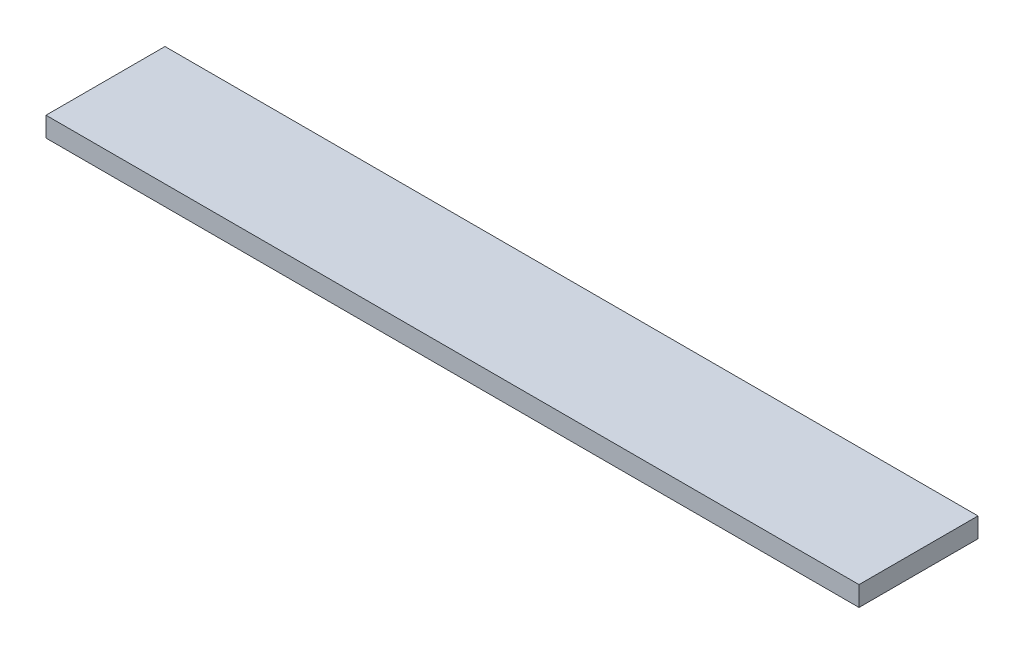
ISO-10303-21;
HEADER;
FILE_DESCRIPTION(('STEP AP214'),'2;1');
FILE_NAME('part.step','',(''),(''),'','','');
FILE_SCHEMA(('AUTOMOTIVE_DESIGN { 1 0 10303 214 1 1 1 1 }'));
ENDSEC;
DATA;
#1=APPLICATION_CONTEXT('core data for automotive mechanical design processes');
#2=APPLICATION_PROTOCOL_DEFINITION('international standard','automotive_design',2000,#1);
#3=PRODUCT_CONTEXT('',#1,'mechanical');
#4=PRODUCT('Part','Part','',(#3));
#5=PRODUCT_RELATED_PRODUCT_CATEGORY('part','',(#4));
#6=PRODUCT_DEFINITION_FORMATION('','',#4);
#7=PRODUCT_DEFINITION_CONTEXT('part definition',#1,'design');
#8=PRODUCT_DEFINITION('design','',#6,#7);
#9=PRODUCT_DEFINITION_SHAPE('','',#8);
#10=(LENGTH_UNIT() NAMED_UNIT(*) SI_UNIT(.MILLI.,.METRE.));
#11=(NAMED_UNIT(*) PLANE_ANGLE_UNIT() SI_UNIT($,.RADIAN.));
#12=(NAMED_UNIT(*) SI_UNIT($,.STERADIAN.) SOLID_ANGLE_UNIT());
#13=UNCERTAINTY_MEASURE_WITH_UNIT(LENGTH_MEASURE(1.E-05),#10,'distance_accuracy_value','');
#14=(GEOMETRIC_REPRESENTATION_CONTEXT(3) GLOBAL_UNCERTAINTY_ASSIGNED_CONTEXT((#13)) GLOBAL_UNIT_ASSIGNED_CONTEXT((#10,
#11,#12)) REPRESENTATION_CONTEXT('',''));
#15=CARTESIAN_POINT('',(0.,0.,0.));
#16=DIRECTION('',(0.,0.,1.));
#17=DIRECTION('',(1.,0.,0.));
#18=AXIS2_PLACEMENT_3D('',#15,#16,#17);
#19=CARTESIAN_POINT('',(-28.3111111111111,12.3555555555555,3.25));
#20=DIRECTION('',(1.,0.,0.));
#21=DIRECTION('',(0.,1.,0.));
#22=AXIS2_PLACEMENT_3D('',#19,#20,#21);
#23=PLANE('',#22);
#24=DIRECTION('',(0.,0.,-1.));
#25=VECTOR('',#24,1.);
#26=CARTESIAN_POINT('',(-28.3111111111111,13.3555555555555,3.25));
#27=LINE('',#26,#25);
#28=CARTESIAN_POINT('',(-28.3111111111111,13.3555555555555,3.25));
#29=VERTEX_POINT('',#28);
#30=CARTESIAN_POINT('',(-28.3111111111111,13.3555555555556,-2.75));
#31=VERTEX_POINT('',#30);
#32=EDGE_CURVE('E98',#29,#31,#27,.T.);
#33=ORIENTED_EDGE('',*,*,#32,.T.);
#34=DIRECTION('',(0.,1.,0.));
#35=VECTOR('',#34,1.);
#36=CARTESIAN_POINT('',(-28.3111111111111,12.3555555555556,-2.75));
#37=LINE('',#36,#35);
#38=CARTESIAN_POINT('',(-28.3111111111111,12.3555555555556,-2.75));
#39=VERTEX_POINT('',#38);
#40=EDGE_CURVE('E11',#39,#31,#37,.T.);
#41=ORIENTED_EDGE('',*,*,#40,.F.);
#42=DIRECTION('',(0.,0.,-1.));
#43=VECTOR('',#42,1.);
#44=CARTESIAN_POINT('',(-28.3111111111111,12.3555555555555,3.25));
#45=LINE('',#44,#43);
#46=CARTESIAN_POINT('',(-28.3111111111111,12.3555555555555,3.25));
#47=VERTEX_POINT('',#46);
#48=EDGE_CURVE('E86',#47,#39,#45,.T.);
#49=ORIENTED_EDGE('',*,*,#48,.F.);
#50=DIRECTION('',(0.,1.,0.));
#51=VECTOR('',#50,1.);
#52=CARTESIAN_POINT('',(-28.3111111111111,12.3555555555555,3.25));
#53=LINE('',#52,#51);
#54=EDGE_CURVE('E94',#47,#29,#53,.T.);
#55=ORIENTED_EDGE('',*,*,#54,.T.);
#56=EDGE_LOOP('',(#33,#41,#49,#55));
#57=FACE_BOUND('',#56,.T.);
#58=ADVANCED_FACE('F35',(#57),#23,.F.);
#59=CARTESIAN_POINT('',(-28.3111111111111,12.3555555555556,-2.75));
#60=DIRECTION('',(0.,0.,1.));
#61=DIRECTION('',(0.,-1.,0.));
#62=AXIS2_PLACEMENT_3D('',#59,#60,#61);
#63=PLANE('',#62);
#64=DIRECTION('',(1.,0.,0.));
#65=VECTOR('',#64,1.);
#66=CARTESIAN_POINT('',(-28.3111111111111,13.3555555555556,-2.75));
#67=LINE('',#66,#65);
#68=CARTESIAN_POINT('',(12.6888888888889,13.3555555555556,-2.75));
#69=VERTEX_POINT('',#68);
#70=EDGE_CURVE('E90',#31,#69,#67,.T.);
#71=ORIENTED_EDGE('',*,*,#70,.T.);
#72=DIRECTION('',(0.,1.,0.));
#73=VECTOR('',#72,1.);
#74=CARTESIAN_POINT('',(12.6888888888889,12.3555555555556,-2.75));
#75=LINE('',#74,#73);
#76=CARTESIAN_POINT('',(12.6888888888889,12.3555555555556,-2.75));
#77=VERTEX_POINT('',#76);
#78=EDGE_CURVE('E43',#77,#69,#75,.T.);
#79=ORIENTED_EDGE('',*,*,#78,.F.);
#80=DIRECTION('',(1.,0.,0.));
#81=VECTOR('',#80,1.);
#82=CARTESIAN_POINT('',(-28.3111111111111,12.3555555555556,-2.75));
#83=LINE('',#82,#81);
#84=EDGE_CURVE('E81',#39,#77,#83,.T.);
#85=ORIENTED_EDGE('',*,*,#84,.F.);
#86=ORIENTED_EDGE('',*,*,#40,.T.);
#87=EDGE_LOOP('',(#71,#79,#85,#86));
#88=FACE_BOUND('',#87,.T.);
#89=ADVANCED_FACE('F89',(#88),#63,.F.);
#90=CARTESIAN_POINT('',(12.6888888888889,12.3555555555555,3.25));
#91=DIRECTION('',(-1.,0.,0.));
#92=DIRECTION('',(0.,0.,-1.));
#93=AXIS2_PLACEMENT_3D('',#90,#91,#92);
#94=PLANE('',#93);
#95=DIRECTION('',(0.,0.,1.));
#96=VECTOR('',#95,1.);
#97=CARTESIAN_POINT('',(12.6888888888889,13.3555555555555,3.25));
#98=LINE('',#97,#96);
#99=CARTESIAN_POINT('',(12.6888888888889,13.3555555555555,3.25));
#100=VERTEX_POINT('',#99);
#101=EDGE_CURVE('E68',#69,#100,#98,.T.);
#102=ORIENTED_EDGE('',*,*,#101,.T.);
#103=DIRECTION('',(0.,1.,0.));
#104=VECTOR('',#103,1.);
#105=CARTESIAN_POINT('',(12.6888888888889,12.3555555555555,3.25));
#106=LINE('',#105,#104);
#107=CARTESIAN_POINT('',(12.6888888888889,12.3555555555555,3.25));
#108=VERTEX_POINT('',#107);
#109=EDGE_CURVE('E91',#108,#100,#106,.T.);
#110=ORIENTED_EDGE('',*,*,#109,.F.);
#111=DIRECTION('',(0.,0.,1.));
#112=VECTOR('',#111,1.);
#113=CARTESIAN_POINT('',(12.6888888888889,12.3555555555555,3.25));
#114=LINE('',#113,#112);
#115=EDGE_CURVE('E84',#77,#108,#114,.T.);
#116=ORIENTED_EDGE('',*,*,#115,.F.);
#117=ORIENTED_EDGE('',*,*,#78,.T.);
#118=EDGE_LOOP('',(#102,#110,#116,#117));
#119=FACE_BOUND('',#118,.T.);
#120=ADVANCED_FACE('F92',(#119),#94,.F.);
#121=CARTESIAN_POINT('',(-28.3111111111111,12.3555555555555,3.25));
#122=DIRECTION('',(0.,0.,-1.));
#123=DIRECTION('',(0.,1.,0.));
#124=AXIS2_PLACEMENT_3D('',#121,#122,#123);
#125=PLANE('',#124);
#126=DIRECTION('',(-1.,0.,0.));
#127=VECTOR('',#126,1.);
#128=CARTESIAN_POINT('',(-28.3111111111111,13.3555555555555,3.25));
#129=LINE('',#128,#127);
#130=EDGE_CURVE('E74',#100,#29,#129,.T.);
#131=ORIENTED_EDGE('',*,*,#130,.T.);
#132=ORIENTED_EDGE('',*,*,#54,.F.);
#133=DIRECTION('',(-1.,0.,0.));
#134=VECTOR('',#133,1.);
#135=CARTESIAN_POINT('',(-28.3111111111111,12.3555555555555,3.25));
#136=LINE('',#135,#134);
#137=EDGE_CURVE('E51',#108,#47,#136,.T.);
#138=ORIENTED_EDGE('',*,*,#137,.F.);
#139=ORIENTED_EDGE('',*,*,#109,.T.);
#140=EDGE_LOOP('',(#131,#132,#138,#139));
#141=FACE_BOUND('',#140,.T.);
#142=ADVANCED_FACE('F105',(#141),#125,.F.);
#143=CARTESIAN_POINT('',(0.,12.3555555555556,-12.8555555555556));
#144=DIRECTION('',(0.,-1.,0.));
#145=DIRECTION('',(1.,0.,0.));
#146=AXIS2_PLACEMENT_3D('',#143,#144,#145);
#147=PLANE('',#146);
#148=ORIENTED_EDGE('',*,*,#48,.T.);
#149=ORIENTED_EDGE('',*,*,#84,.T.);
#150=ORIENTED_EDGE('',*,*,#115,.T.);
#151=ORIENTED_EDGE('',*,*,#137,.T.);
#152=EDGE_LOOP('',(#148,#149,#150,#151));
#153=FACE_BOUND('',#152,.T.);
#154=ADVANCED_FACE('F82',(#153),#147,.T.);
#155=CARTESIAN_POINT('',(0.,13.3555555555556,-12.8555555555555));
#156=DIRECTION('',(0.,-1.,0.));
#157=DIRECTION('',(1.,0.,0.));
#158=AXIS2_PLACEMENT_3D('',#155,#156,#157);
#159=PLANE('',#158);
#160=ORIENTED_EDGE('',*,*,#32,.F.);
#161=ORIENTED_EDGE('',*,*,#130,.F.);
#162=ORIENTED_EDGE('',*,*,#101,.F.);
#163=ORIENTED_EDGE('',*,*,#70,.F.);
#164=EDGE_LOOP('',(#160,#161,#162,#163));
#165=FACE_BOUND('',#164,.T.);
#166=ADVANCED_FACE('F108',(#165),#159,.F.);
#167=CLOSED_SHELL('',(#58,#89,#120,#142,#154,#166));
#168=MANIFOLD_SOLID_BREP('B2',#167);
#169=ADVANCED_BREP_SHAPE_REPRESENTATION('',(#18,#168),#14);
#170=SHAPE_DEFINITION_REPRESENTATION(#9,#169);
ENDSEC;
END-ISO-10303-21;
